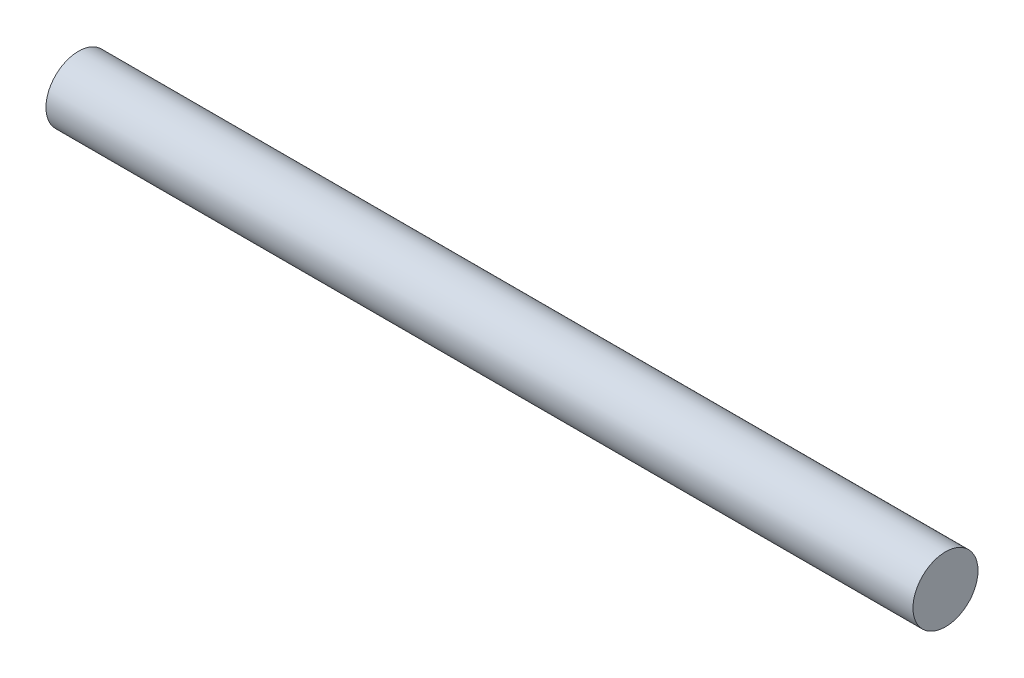
ISO-10303-21;
HEADER;
FILE_DESCRIPTION(('STEP AP214'),'2;1');
FILE_NAME('part.step','',(''),(''),'','','');
FILE_SCHEMA(('AUTOMOTIVE_DESIGN { 1 0 10303 214 1 1 1 1 }'));
ENDSEC;
DATA;
#1=APPLICATION_CONTEXT('core data for automotive mechanical design processes');
#2=APPLICATION_PROTOCOL_DEFINITION('international standard','automotive_design',2000,#1);
#3=PRODUCT_CONTEXT('',#1,'mechanical');
#4=PRODUCT('Part','Part','',(#3));
#5=PRODUCT_RELATED_PRODUCT_CATEGORY('part','',(#4));
#6=PRODUCT_DEFINITION_FORMATION('','',#4);
#7=PRODUCT_DEFINITION_CONTEXT('part definition',#1,'design');
#8=PRODUCT_DEFINITION('design','',#6,#7);
#9=PRODUCT_DEFINITION_SHAPE('','',#8);
#10=(LENGTH_UNIT() NAMED_UNIT(*) SI_UNIT(.MILLI.,.METRE.));
#11=(NAMED_UNIT(*) PLANE_ANGLE_UNIT() SI_UNIT($,.RADIAN.));
#12=(NAMED_UNIT(*) SI_UNIT($,.STERADIAN.) SOLID_ANGLE_UNIT());
#13=UNCERTAINTY_MEASURE_WITH_UNIT(LENGTH_MEASURE(1.E-05),#10,'distance_accuracy_value','');
#14=(GEOMETRIC_REPRESENTATION_CONTEXT(3) GLOBAL_UNCERTAINTY_ASSIGNED_CONTEXT((#13)) GLOBAL_UNIT_ASSIGNED_CONTEXT((#10,
#11,#12)) REPRESENTATION_CONTEXT('',''));
#15=CARTESIAN_POINT('',(0.,0.,0.));
#16=DIRECTION('',(0.,0.,1.));
#17=DIRECTION('',(1.,0.,0.));
#18=AXIS2_PLACEMENT_3D('',#15,#16,#17);
#19=CARTESIAN_POINT('',(16.,0.,0.));
#20=DIRECTION('',(-1.,0.,0.));
#21=DIRECTION('',(0.,0.,1.));
#22=AXIS2_PLACEMENT_3D('',#19,#20,#21);
#23=CYLINDRICAL_SURFACE('',#22,0.6);
#24=CARTESIAN_POINT('',(16.,0.,0.));
#25=DIRECTION('',(1.,0.,0.));
#26=DIRECTION('',(0.,0.,-1.));
#27=AXIS2_PLACEMENT_3D('',#24,#25,#26);
#28=CIRCLE('',#27,0.6);
#29=CARTESIAN_POINT('',(16.,0.,-0.6));
#30=VERTEX_POINT('',#29);
#31=EDGE_CURVE('E10',#30,#30,#28,.T.);
#32=ORIENTED_EDGE('',*,*,#31,.F.);
#33=EDGE_LOOP('',(#32));
#34=FACE_BOUND('',#33,.T.);
#35=CARTESIAN_POINT('',(0.,0.,0.));
#36=DIRECTION('',(1.,0.,0.));
#37=DIRECTION('',(0.,0.,-1.));
#38=AXIS2_PLACEMENT_3D('',#35,#36,#37);
#39=CIRCLE('',#38,0.6);
#40=CARTESIAN_POINT('',(0.,0.,-0.6));
#41=VERTEX_POINT('',#40);
#42=EDGE_CURVE('E44',#41,#41,#39,.T.);
#43=ORIENTED_EDGE('',*,*,#42,.T.);
#44=EDGE_LOOP('',(#43));
#45=FACE_BOUND('',#44,.T.);
#46=ADVANCED_FACE('F41',(#34,#45),#23,.T.);
#47=CARTESIAN_POINT('',(16.,0.,0.));
#48=DIRECTION('',(1.,0.,0.));
#49=DIRECTION('',(0.,0.,-1.));
#50=AXIS2_PLACEMENT_3D('',#47,#48,#49);
#51=PLANE('',#50);
#52=ORIENTED_EDGE('',*,*,#31,.T.);
#53=EDGE_LOOP('',(#52));
#54=FACE_BOUND('',#53,.T.);
#55=ADVANCED_FACE('F58',(#54),#51,.T.);
#56=CARTESIAN_POINT('',(0.,0.,0.));
#57=DIRECTION('',(1.,0.,0.));
#58=DIRECTION('',(0.,0.,-1.));
#59=AXIS2_PLACEMENT_3D('',#56,#57,#58);
#60=PLANE('',#59);
#61=ORIENTED_EDGE('',*,*,#42,.F.);
#62=EDGE_LOOP('',(#61));
#63=FACE_BOUND('',#62,.T.);
#64=ADVANCED_FACE('F56',(#63),#60,.F.);
#65=CLOSED_SHELL('',(#46,#55,#64));
#66=MANIFOLD_SOLID_BREP('B2',#65);
#67=ADVANCED_BREP_SHAPE_REPRESENTATION('',(#18,#66),#14);
#68=SHAPE_DEFINITION_REPRESENTATION(#9,#67);
ENDSEC;
END-ISO-10303-21;
